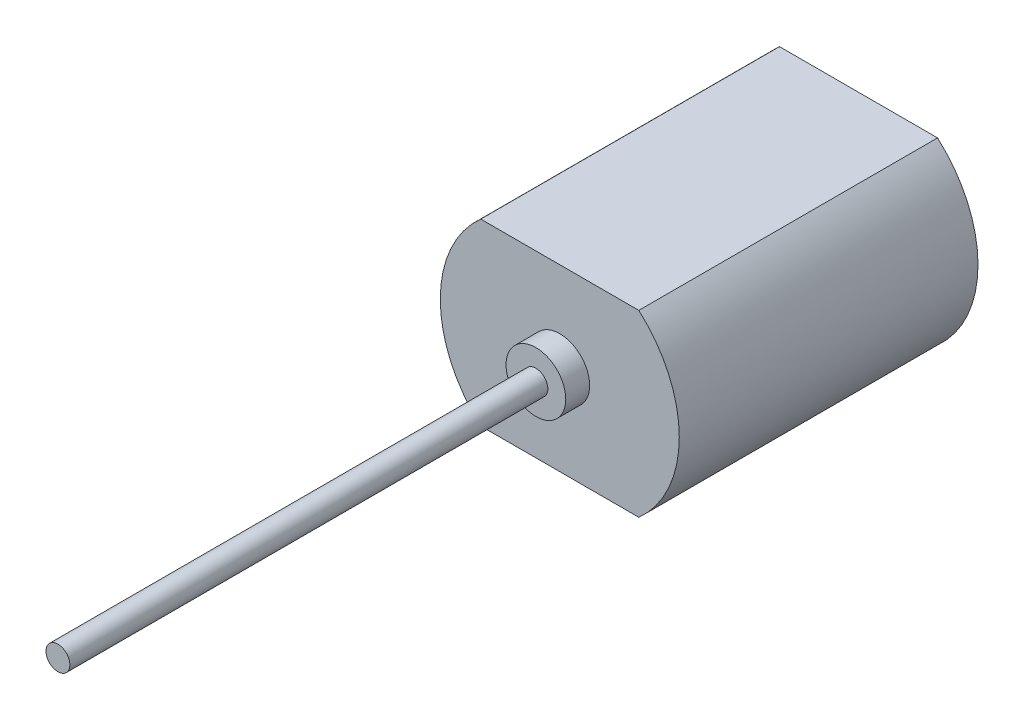
ISO-10303-21;
HEADER;
FILE_DESCRIPTION(('STEP AP214'),'2;1');
FILE_NAME('part.step','',(''),(''),'','','');
FILE_SCHEMA(('AUTOMOTIVE_DESIGN { 1 0 10303 214 1 1 1 1 }'));
ENDSEC;
DATA;
#1=APPLICATION_CONTEXT('core data for automotive mechanical design processes');
#2=APPLICATION_PROTOCOL_DEFINITION('international standard','automotive_design',2000,#1);
#3=PRODUCT_CONTEXT('',#1,'mechanical');
#4=PRODUCT('Part','Part','',(#3));
#5=PRODUCT_RELATED_PRODUCT_CATEGORY('part','',(#4));
#6=PRODUCT_DEFINITION_FORMATION('','',#4);
#7=PRODUCT_DEFINITION_CONTEXT('part definition',#1,'design');
#8=PRODUCT_DEFINITION('design','',#6,#7);
#9=PRODUCT_DEFINITION_SHAPE('','',#8);
#10=(LENGTH_UNIT() NAMED_UNIT(*) SI_UNIT(.MILLI.,.METRE.));
#11=(NAMED_UNIT(*) PLANE_ANGLE_UNIT() SI_UNIT($,.RADIAN.));
#12=(NAMED_UNIT(*) SI_UNIT($,.STERADIAN.) SOLID_ANGLE_UNIT());
#13=UNCERTAINTY_MEASURE_WITH_UNIT(LENGTH_MEASURE(1.E-05),#10,'distance_accuracy_value','');
#14=(GEOMETRIC_REPRESENTATION_CONTEXT(3) GLOBAL_UNCERTAINTY_ASSIGNED_CONTEXT((#13)) GLOBAL_UNIT_ASSIGNED_CONTEXT((#10,
#11,#12)) REPRESENTATION_CONTEXT('',''));
#15=CARTESIAN_POINT('',(0.,0.,0.));
#16=DIRECTION('',(0.,0.,1.));
#17=DIRECTION('',(1.,0.,0.));
#18=AXIS2_PLACEMENT_3D('',#15,#16,#17);
#19=CARTESIAN_POINT('',(0.,0.,12.5));
#20=DIRECTION('',(0.,0.,-1.));
#21=DIRECTION('',(-1.,0.,0.));
#22=AXIS2_PLACEMENT_3D('',#19,#20,#21);
#23=CYLINDRICAL_SURFACE('',#22,10.);
#24=CARTESIAN_POINT('',(0.,0.,-12.5));
#25=DIRECTION('',(0.,0.,1.));
#26=DIRECTION('',(1.,0.,0.));
#27=AXIS2_PLACEMENT_3D('',#24,#25,#26);
#28=CIRCLE('',#27,10.);
#29=CARTESIAN_POINT('',(-6.61437827766148,7.5,-12.5));
#30=VERTEX_POINT('',#29);
#31=CARTESIAN_POINT('',(-6.61437827766148,-7.5,-12.5));
#32=VERTEX_POINT('',#31);
#33=EDGE_CURVE('E111',#30,#32,#28,.T.);
#34=ORIENTED_EDGE('',*,*,#33,.T.);
#35=DIRECTION('',(0.,0.,-1.));
#36=VECTOR('',#35,1.);
#37=CARTESIAN_POINT('',(-6.61437827766148,-7.5,12.5));
#38=LINE('',#37,#36);
#39=CARTESIAN_POINT('',(-6.61437827766148,-7.5,12.5));
#40=VERTEX_POINT('',#39);
#41=EDGE_CURVE('E42',#40,#32,#38,.T.);
#42=ORIENTED_EDGE('',*,*,#41,.F.);
#43=CARTESIAN_POINT('',(0.,0.,12.5));
#44=DIRECTION('',(0.,0.,1.));
#45=DIRECTION('',(1.,0.,0.));
#46=AXIS2_PLACEMENT_3D('',#43,#44,#45);
#47=CIRCLE('',#46,10.);
#48=CARTESIAN_POINT('',(-6.61437827766148,7.5,12.5));
#49=VERTEX_POINT('',#48);
#50=EDGE_CURVE('E94',#49,#40,#47,.T.);
#51=ORIENTED_EDGE('',*,*,#50,.F.);
#52=DIRECTION('',(0.,0.,-1.));
#53=VECTOR('',#52,1.);
#54=CARTESIAN_POINT('',(-6.61437827766148,7.5,12.5));
#55=LINE('',#54,#53);
#56=EDGE_CURVE('E107',#49,#30,#55,.T.);
#57=ORIENTED_EDGE('',*,*,#56,.T.);
#58=EDGE_LOOP('',(#34,#42,#51,#57));
#59=FACE_BOUND('',#58,.T.);
#60=ADVANCED_FACE('F39',(#59),#23,.T.);
#61=CARTESIAN_POINT('',(6.61437827766148,-7.5,12.5));
#62=DIRECTION('',(0.,1.,0.));
#63=DIRECTION('',(0.,0.,1.));
#64=AXIS2_PLACEMENT_3D('',#61,#62,#63);
#65=PLANE('',#64);
#66=DIRECTION('',(1.,0.,0.));
#67=VECTOR('',#66,1.);
#68=CARTESIAN_POINT('',(6.61437827766148,-7.5,-12.5));
#69=LINE('',#68,#67);
#70=CARTESIAN_POINT('',(6.61437827766148,-7.5,-12.5));
#71=VERTEX_POINT('',#70);
#72=EDGE_CURVE('E100',#32,#71,#69,.T.);
#73=ORIENTED_EDGE('',*,*,#72,.T.);
#74=DIRECTION('',(0.,0.,-1.));
#75=VECTOR('',#74,1.);
#76=CARTESIAN_POINT('',(6.61437827766148,-7.5,12.5));
#77=LINE('',#76,#75);
#78=CARTESIAN_POINT('',(6.61437827766148,-7.5,12.5));
#79=VERTEX_POINT('',#78);
#80=EDGE_CURVE('E98',#79,#71,#77,.T.);
#81=ORIENTED_EDGE('',*,*,#80,.F.);
#82=DIRECTION('',(1.,0.,0.));
#83=VECTOR('',#82,1.);
#84=CARTESIAN_POINT('',(6.61437827766148,-7.5,12.5));
#85=LINE('',#84,#83);
#86=EDGE_CURVE('E89',#40,#79,#85,.T.);
#87=ORIENTED_EDGE('',*,*,#86,.F.);
#88=ORIENTED_EDGE('',*,*,#41,.T.);
#89=EDGE_LOOP('',(#73,#81,#87,#88));
#90=FACE_BOUND('',#89,.T.);
#91=ADVANCED_FACE('F99',(#90),#65,.F.);
#92=CARTESIAN_POINT('',(0.,0.,12.5));
#93=DIRECTION('',(0.,0.,-1.));
#94=DIRECTION('',(-1.,0.,0.));
#95=AXIS2_PLACEMENT_3D('',#92,#93,#94);
#96=CYLINDRICAL_SURFACE('',#95,10.);
#97=CARTESIAN_POINT('',(0.,0.,-12.5));
#98=DIRECTION('',(0.,0.,1.));
#99=DIRECTION('',(1.,0.,0.));
#100=AXIS2_PLACEMENT_3D('',#97,#98,#99);
#101=CIRCLE('',#100,10.);
#102=CARTESIAN_POINT('',(6.61437827766148,7.5,-12.5));
#103=VERTEX_POINT('',#102);
#104=EDGE_CURVE('E75',#71,#103,#101,.T.);
#105=ORIENTED_EDGE('',*,*,#104,.T.);
#106=DIRECTION('',(0.,0.,-1.));
#107=VECTOR('',#106,1.);
#108=CARTESIAN_POINT('',(6.61437827766148,7.5,12.5));
#109=LINE('',#108,#107);
#110=CARTESIAN_POINT('',(6.61437827766148,7.5,12.5));
#111=VERTEX_POINT('',#110);
#112=EDGE_CURVE('E102',#111,#103,#109,.T.);
#113=ORIENTED_EDGE('',*,*,#112,.F.);
#114=CARTESIAN_POINT('',(0.,0.,12.5));
#115=DIRECTION('',(0.,0.,1.));
#116=DIRECTION('',(1.,0.,0.));
#117=AXIS2_PLACEMENT_3D('',#114,#115,#116);
#118=CIRCLE('',#117,10.);
#119=EDGE_CURVE('E92',#79,#111,#118,.T.);
#120=ORIENTED_EDGE('',*,*,#119,.F.);
#121=ORIENTED_EDGE('',*,*,#80,.T.);
#122=EDGE_LOOP('',(#105,#113,#120,#121));
#123=FACE_BOUND('',#122,.T.);
#124=ADVANCED_FACE('F103',(#123),#96,.T.);
#125=CARTESIAN_POINT('',(-6.61437827766148,7.5,12.5));
#126=DIRECTION('',(0.,-1.,0.));
#127=DIRECTION('',(0.,0.,-1.));
#128=AXIS2_PLACEMENT_3D('',#125,#126,#127);
#129=PLANE('',#128);
#130=DIRECTION('',(-1.,0.,0.));
#131=VECTOR('',#130,1.);
#132=CARTESIAN_POINT('',(-6.61437827766148,7.5,-12.5));
#133=LINE('',#132,#131);
#134=EDGE_CURVE('E81',#103,#30,#133,.T.);
#135=ORIENTED_EDGE('',*,*,#134,.T.);
#136=ORIENTED_EDGE('',*,*,#56,.F.);
#137=DIRECTION('',(-1.,0.,0.));
#138=VECTOR('',#137,1.);
#139=CARTESIAN_POINT('',(-6.61437827766148,7.5,12.5));
#140=LINE('',#139,#138);
#141=EDGE_CURVE('E58',#111,#49,#140,.T.);
#142=ORIENTED_EDGE('',*,*,#141,.F.);
#143=ORIENTED_EDGE('',*,*,#112,.T.);
#144=EDGE_LOOP('',(#135,#136,#142,#143));
#145=FACE_BOUND('',#144,.T.);
#146=ADVANCED_FACE('F125',(#145),#129,.F.);
#147=CARTESIAN_POINT('',(0.,0.,12.5));
#148=DIRECTION('',(0.,0.,1.));
#149=DIRECTION('',(1.,0.,0.));
#150=AXIS2_PLACEMENT_3D('',#147,#148,#149);
#151=PLANE('',#150);
#152=CARTESIAN_POINT('',(0.,0.,12.5));
#153=DIRECTION('',(0.,0.,1.));
#154=DIRECTION('',(1.,0.,0.));
#155=AXIS2_PLACEMENT_3D('',#152,#153,#154);
#156=CIRCLE('',#155,2.5);
#157=CARTESIAN_POINT('',(2.5,0.,12.5));
#158=VERTEX_POINT('',#157);
#159=EDGE_CURVE('E49',#158,#158,#156,.T.);
#160=ORIENTED_EDGE('',*,*,#159,.F.);
#161=EDGE_LOOP('',(#160));
#162=FACE_BOUND('',#161,.T.);
#163=ORIENTED_EDGE('',*,*,#50,.T.);
#164=ORIENTED_EDGE('',*,*,#86,.T.);
#165=ORIENTED_EDGE('',*,*,#119,.T.);
#166=ORIENTED_EDGE('',*,*,#141,.T.);
#167=EDGE_LOOP('',(#163,#164,#165,#166));
#168=FACE_BOUND('',#167,.T.);
#169=ADVANCED_FACE('F90',(#162,#168),#151,.T.);
#170=CARTESIAN_POINT('',(0.,0.,-12.5));
#171=DIRECTION('',(0.,0.,1.));
#172=DIRECTION('',(1.,0.,0.));
#173=AXIS2_PLACEMENT_3D('',#170,#171,#172);
#174=PLANE('',#173);
#175=ORIENTED_EDGE('',*,*,#33,.F.);
#176=ORIENTED_EDGE('',*,*,#134,.F.);
#177=ORIENTED_EDGE('',*,*,#104,.F.);
#178=ORIENTED_EDGE('',*,*,#72,.F.);
#179=EDGE_LOOP('',(#175,#176,#177,#178));
#180=FACE_BOUND('',#179,.T.);
#181=ADVANCED_FACE('F128',(#180),#174,.F.);
#182=CARTESIAN_POINT('',(0.,0.,14.5));
#183=DIRECTION('',(0.,0.,-1.));
#184=DIRECTION('',(-1.,0.,0.));
#185=AXIS2_PLACEMENT_3D('',#182,#183,#184);
#186=CYLINDRICAL_SURFACE('',#185,2.5);
#187=CARTESIAN_POINT('',(0.,0.,14.5));
#188=DIRECTION('',(0.,0.,1.));
#189=DIRECTION('',(1.,0.,0.));
#190=AXIS2_PLACEMENT_3D('',#187,#188,#189);
#191=CIRCLE('',#190,2.5);
#192=CARTESIAN_POINT('',(2.5,0.,14.5));
#193=VERTEX_POINT('',#192);
#194=EDGE_CURVE('E115',#193,#193,#191,.T.);
#195=ORIENTED_EDGE('',*,*,#194,.F.);
#196=EDGE_LOOP('',(#195));
#197=FACE_BOUND('',#196,.T.);
#198=ORIENTED_EDGE('',*,*,#159,.T.);
#199=EDGE_LOOP('',(#198));
#200=FACE_BOUND('',#199,.T.);
#201=ADVANCED_FACE('F154',(#197,#200),#186,.T.);
#202=CARTESIAN_POINT('',(0.,0.,14.5));
#203=DIRECTION('',(0.,0.,1.));
#204=DIRECTION('',(1.,0.,0.));
#205=AXIS2_PLACEMENT_3D('',#202,#203,#204);
#206=PLANE('',#205);
#207=CARTESIAN_POINT('',(0.,0.,14.5));
#208=DIRECTION('',(0.,0.,1.));
#209=DIRECTION('',(1.,0.,0.));
#210=AXIS2_PLACEMENT_3D('',#207,#208,#209);
#211=CIRCLE('',#210,1.);
#212=CARTESIAN_POINT('',(1.,0.,14.5));
#213=VERTEX_POINT('',#212);
#214=EDGE_CURVE('E11',#213,#213,#211,.T.);
#215=ORIENTED_EDGE('',*,*,#214,.F.);
#216=EDGE_LOOP('',(#215));
#217=FACE_BOUND('',#216,.T.);
#218=ORIENTED_EDGE('',*,*,#194,.T.);
#219=EDGE_LOOP('',(#218));
#220=FACE_BOUND('',#219,.T.);
#221=ADVANCED_FACE('F148',(#217,#220),#206,.T.);
#222=CARTESIAN_POINT('',(0.,0.,54.5));
#223=DIRECTION('',(0.,0.,-1.));
#224=DIRECTION('',(-1.,0.,0.));
#225=AXIS2_PLACEMENT_3D('',#222,#223,#224);
#226=CYLINDRICAL_SURFACE('',#225,1.);
#227=CARTESIAN_POINT('',(0.,0.,54.5));
#228=DIRECTION('',(0.,0.,1.));
#229=DIRECTION('',(1.,0.,0.));
#230=AXIS2_PLACEMENT_3D('',#227,#228,#229);
#231=CIRCLE('',#230,1.);
#232=CARTESIAN_POINT('',(1.,0.,54.5));
#233=VERTEX_POINT('',#232);
#234=EDGE_CURVE('E137',#233,#233,#231,.T.);
#235=ORIENTED_EDGE('',*,*,#234,.F.);
#236=EDGE_LOOP('',(#235));
#237=FACE_BOUND('',#236,.T.);
#238=ORIENTED_EDGE('',*,*,#214,.T.);
#239=EDGE_LOOP('',(#238));
#240=FACE_BOUND('',#239,.T.);
#241=ADVANCED_FACE('F145',(#237,#240),#226,.T.);
#242=CARTESIAN_POINT('',(0.,0.,54.5));
#243=DIRECTION('',(0.,0.,1.));
#244=DIRECTION('',(1.,0.,0.));
#245=AXIS2_PLACEMENT_3D('',#242,#243,#244);
#246=PLANE('',#245);
#247=ORIENTED_EDGE('',*,*,#234,.T.);
#248=EDGE_LOOP('',(#247));
#249=FACE_BOUND('',#248,.T.);
#250=ADVANCED_FACE('F143',(#249),#246,.T.);
#251=CLOSED_SHELL('',(#60,#91,#124,#146,#169,#181,#201,#221,#241,#250));
#252=MANIFOLD_SOLID_BREP('B2',#251);
#253=ADVANCED_BREP_SHAPE_REPRESENTATION('',(#18,#252),#14);
#254=SHAPE_DEFINITION_REPRESENTATION(#9,#253);
ENDSEC;
END-ISO-10303-21;
